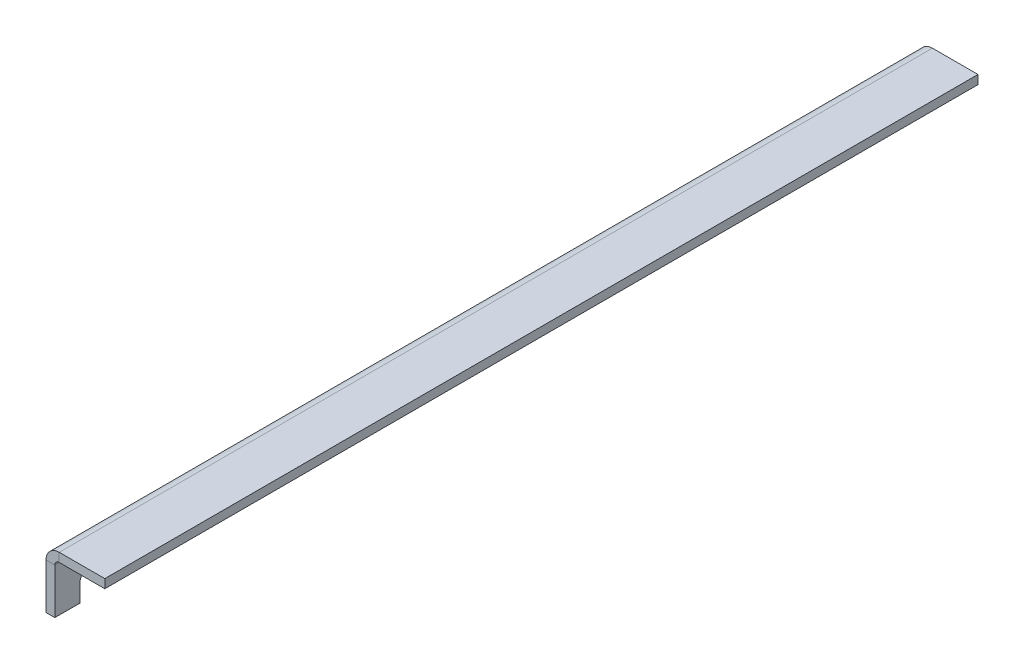
ISO-10303-21;
HEADER;
FILE_DESCRIPTION(('STEP AP214'),'2;1');
FILE_NAME('part.step','',(''),(''),'','','');
FILE_SCHEMA(('AUTOMOTIVE_DESIGN { 1 0 10303 214 1 1 1 1 }'));
ENDSEC;
DATA;
#1=APPLICATION_CONTEXT('core data for automotive mechanical design processes');
#2=APPLICATION_PROTOCOL_DEFINITION('international standard','automotive_design',2000,#1);
#3=PRODUCT_CONTEXT('',#1,'mechanical');
#4=PRODUCT('Part','Part','',(#3));
#5=PRODUCT_RELATED_PRODUCT_CATEGORY('part','',(#4));
#6=PRODUCT_DEFINITION_FORMATION('','',#4);
#7=PRODUCT_DEFINITION_CONTEXT('part definition',#1,'design');
#8=PRODUCT_DEFINITION('design','',#6,#7);
#9=PRODUCT_DEFINITION_SHAPE('','',#8);
#10=(LENGTH_UNIT() NAMED_UNIT(*) SI_UNIT(.MILLI.,.METRE.));
#11=(NAMED_UNIT(*) PLANE_ANGLE_UNIT() SI_UNIT($,.RADIAN.));
#12=(NAMED_UNIT(*) SI_UNIT($,.STERADIAN.) SOLID_ANGLE_UNIT());
#13=UNCERTAINTY_MEASURE_WITH_UNIT(LENGTH_MEASURE(1.E-05),#10,'distance_accuracy_value','');
#14=(GEOMETRIC_REPRESENTATION_CONTEXT(3) GLOBAL_UNCERTAINTY_ASSIGNED_CONTEXT((#13)) GLOBAL_UNIT_ASSIGNED_CONTEXT((#10,
#11,#12)) REPRESENTATION_CONTEXT('',''));
#15=CARTESIAN_POINT('',(0.,0.,0.));
#16=DIRECTION('',(0.,0.,1.));
#17=DIRECTION('',(1.,0.,0.));
#18=AXIS2_PLACEMENT_3D('',#15,#16,#17);
#19=CARTESIAN_POINT('',(2.99999999999994,-20.,148.5));
#20=DIRECTION('',(0.,-1.,0.));
#21=DIRECTION('',(1.,0.,0.));
#22=AXIS2_PLACEMENT_3D('',#19,#20,#21);
#23=PLANE('',#22);
#24=DIRECTION('',(-1.,0.,0.));
#25=VECTOR('',#24,1.);
#26=CARTESIAN_POINT('',(2.99999999999994,-20.,140.));
#27=LINE('',#26,#25);
#28=CARTESIAN_POINT('',(2.99999999999994,-20.,140.));
#29=VERTEX_POINT('',#28);
#30=CARTESIAN_POINT('',(-1.11022302462516E-13,-20.,140.));
#31=VERTEX_POINT('',#30);
#32=EDGE_CURVE('E245',#29,#31,#27,.T.);
#33=ORIENTED_EDGE('',*,*,#32,.F.);
#34=DIRECTION('',(0.,0.,-1.));
#35=VECTOR('',#34,1.);
#36=CARTESIAN_POINT('',(2.99999999999994,-20.,148.5));
#37=LINE('',#36,#35);
#38=CARTESIAN_POINT('',(2.99999999999994,-20.,148.5));
#39=VERTEX_POINT('',#38);
#40=EDGE_CURVE('E274',#39,#29,#37,.T.);
#41=ORIENTED_EDGE('',*,*,#40,.F.);
#42=DIRECTION('',(-1.,0.,0.));
#43=VECTOR('',#42,1.);
#44=CARTESIAN_POINT('',(2.99999999999994,-20.,148.5));
#45=LINE('',#44,#43);
#46=CARTESIAN_POINT('',(0.,-20.,148.5));
#47=VERTEX_POINT('',#46);
#48=EDGE_CURVE('E261',#39,#47,#45,.T.);
#49=ORIENTED_EDGE('',*,*,#48,.T.);
#50=DIRECTION('',(0.,0.,-1.));
#51=VECTOR('',#50,1.);
#52=CARTESIAN_POINT('',(0.,-20.,148.5));
#53=LINE('',#52,#51);
#54=EDGE_CURVE('E278',#47,#31,#53,.T.);
#55=ORIENTED_EDGE('',*,*,#54,.T.);
#56=EDGE_LOOP('',(#33,#41,#49,#55));
#57=FACE_BOUND('',#56,.T.);
#58=ADVANCED_FACE('F41',(#57),#23,.T.);
#59=CARTESIAN_POINT('',(4.49999999999999,0.,148.5));
#60=DIRECTION('',(0.,0.,1.));
#61=DIRECTION('',(1.,0.,0.));
#62=AXIS2_PLACEMENT_3D('',#59,#60,#61);
#63=PLANE('',#62);
#64=DIRECTION('',(0.,-1.,0.));
#65=VECTOR('',#64,1.);
#66=CARTESIAN_POINT('',(4.49999999999999,0.,148.5));
#67=LINE('',#66,#65);
#68=CARTESIAN_POINT('',(4.49999999999999,0.,148.5));
#69=VERTEX_POINT('',#68);
#70=CARTESIAN_POINT('',(4.49999999999999,-3.,148.5));
#71=VERTEX_POINT('',#70);
#72=EDGE_CURVE('E49',#69,#71,#67,.T.);
#73=ORIENTED_EDGE('',*,*,#72,.F.);
#74=CARTESIAN_POINT('',(4.49999999999999,-4.5,148.5));
#75=DIRECTION('',(0.,0.,1.));
#76=DIRECTION('',(1.,0.,0.));
#77=AXIS2_PLACEMENT_3D('',#74,#75,#76);
#78=CIRCLE('',#77,4.5);
#79=CARTESIAN_POINT('',(0.,-4.49999999999999,148.5));
#80=VERTEX_POINT('',#79);
#81=EDGE_CURVE('E255',#80,#69,#78,.F.);
#82=ORIENTED_EDGE('',*,*,#81,.F.);
#83=DIRECTION('',(-1.,0.,0.));
#84=VECTOR('',#83,1.);
#85=CARTESIAN_POINT('',(2.99999999999999,-4.5,148.5));
#86=LINE('',#85,#84);
#87=CARTESIAN_POINT('',(2.99999999999999,-4.5,148.5));
#88=VERTEX_POINT('',#87);
#89=EDGE_CURVE('E289',#88,#80,#86,.T.);
#90=ORIENTED_EDGE('',*,*,#89,.F.);
#91=CARTESIAN_POINT('',(4.49999999999999,-4.5,148.5));
#92=DIRECTION('',(0.,0.,1.));
#93=DIRECTION('',(1.,0.,0.));
#94=AXIS2_PLACEMENT_3D('',#91,#92,#93);
#95=CIRCLE('',#94,1.5);
#96=EDGE_CURVE('E267',#88,#71,#95,.F.);
#97=ORIENTED_EDGE('',*,*,#96,.T.);
#98=EDGE_LOOP('',(#73,#82,#90,#97));
#99=FACE_BOUND('',#98,.T.);
#100=ADVANCED_FACE('F43',(#99),#63,.T.);
#101=CARTESIAN_POINT('',(2.99999999999999,-4.5,148.5));
#102=DIRECTION('',(0.,0.,1.));
#103=DIRECTION('',(1.,0.,0.));
#104=AXIS2_PLACEMENT_3D('',#101,#102,#103);
#105=PLANE('',#104);
#106=DIRECTION('',(1.,0.,0.));
#107=VECTOR('',#106,1.);
#108=CARTESIAN_POINT('',(0.,0.,148.5));
#109=LINE('',#108,#107);
#110=CARTESIAN_POINT('',(20.,0.,148.5));
#111=VERTEX_POINT('',#110);
#112=EDGE_CURVE('E252',#69,#111,#109,.T.);
#113=ORIENTED_EDGE('',*,*,#112,.F.);
#114=ORIENTED_EDGE('',*,*,#72,.T.);
#115=DIRECTION('',(1.,0.,0.));
#116=VECTOR('',#115,1.);
#117=CARTESIAN_POINT('',(0.,-3.,148.5));
#118=LINE('',#117,#116);
#119=CARTESIAN_POINT('',(20.,-3.,148.5));
#120=VERTEX_POINT('',#119);
#121=EDGE_CURVE('E247',#71,#120,#118,.T.);
#122=ORIENTED_EDGE('',*,*,#121,.T.);
#123=DIRECTION('',(0.,-1.,0.));
#124=VECTOR('',#123,1.);
#125=CARTESIAN_POINT('',(20.,0.,148.5));
#126=LINE('',#125,#124);
#127=EDGE_CURVE('E249',#111,#120,#126,.T.);
#128=ORIENTED_EDGE('',*,*,#127,.F.);
#129=EDGE_LOOP('',(#113,#114,#122,#128));
#130=FACE_BOUND('',#129,.T.);
#131=ADVANCED_FACE('F322',(#130),#105,.T.);
#132=CARTESIAN_POINT('',(0.,-3.,148.5));
#133=DIRECTION('',(0.,1.,0.));
#134=DIRECTION('',(-1.,0.,0.));
#135=AXIS2_PLACEMENT_3D('',#132,#133,#134);
#136=PLANE('',#135);
#137=DIRECTION('',(0.,0.,-1.));
#138=VECTOR('',#137,1.);
#139=CARTESIAN_POINT('',(4.49999999999999,-3.,148.5));
#140=LINE('',#139,#138);
#141=CARTESIAN_POINT('',(4.49999999999999,-3.,-148.5));
#142=VERTEX_POINT('',#141);
#143=EDGE_CURVE('E269',#71,#142,#140,.T.);
#144=ORIENTED_EDGE('',*,*,#143,.T.);
#145=DIRECTION('',(1.,0.,0.));
#146=VECTOR('',#145,1.);
#147=CARTESIAN_POINT('',(0.,-3.,-148.5));
#148=LINE('',#147,#146);
#149=CARTESIAN_POINT('',(20.,-3.,-148.5));
#150=VERTEX_POINT('',#149);
#151=EDGE_CURVE('E189',#142,#150,#148,.T.);
#152=ORIENTED_EDGE('',*,*,#151,.T.);
#153=DIRECTION('',(0.,0.,-1.));
#154=VECTOR('',#153,1.);
#155=CARTESIAN_POINT('',(20.,-3.,148.5));
#156=LINE('',#155,#154);
#157=EDGE_CURVE('E287',#120,#150,#156,.T.);
#158=ORIENTED_EDGE('',*,*,#157,.F.);
#159=ORIENTED_EDGE('',*,*,#121,.F.);
#160=EDGE_LOOP('',(#144,#152,#158,#159));
#161=FACE_BOUND('',#160,.T.);
#162=ADVANCED_FACE('F320',(#161),#136,.F.);
#163=CARTESIAN_POINT('',(20.,0.,148.5));
#164=DIRECTION('',(1.,0.,0.));
#165=DIRECTION('',(0.,0.,-1.));
#166=AXIS2_PLACEMENT_3D('',#163,#164,#165);
#167=PLANE('',#166);
#168=ORIENTED_EDGE('',*,*,#157,.T.);
#169=DIRECTION('',(0.,-1.,0.));
#170=VECTOR('',#169,1.);
#171=CARTESIAN_POINT('',(20.,0.,-148.5));
#172=LINE('',#171,#170);
#173=CARTESIAN_POINT('',(20.,0.,-148.5));
#174=VERTEX_POINT('',#173);
#175=EDGE_CURVE('E192',#174,#150,#172,.T.);
#176=ORIENTED_EDGE('',*,*,#175,.F.);
#177=DIRECTION('',(0.,0.,-1.));
#178=VECTOR('',#177,1.);
#179=CARTESIAN_POINT('',(20.,0.,148.5));
#180=LINE('',#179,#178);
#181=EDGE_CURVE('E285',#111,#174,#180,.T.);
#182=ORIENTED_EDGE('',*,*,#181,.F.);
#183=ORIENTED_EDGE('',*,*,#127,.T.);
#184=EDGE_LOOP('',(#168,#176,#182,#183));
#185=FACE_BOUND('',#184,.T.);
#186=ADVANCED_FACE('F333',(#185),#167,.T.);
#187=CARTESIAN_POINT('',(0.,0.,148.5));
#188=DIRECTION('',(0.,1.,0.));
#189=DIRECTION('',(-1.,0.,0.));
#190=AXIS2_PLACEMENT_3D('',#187,#188,#189);
#191=PLANE('',#190);
#192=ORIENTED_EDGE('',*,*,#181,.T.);
#193=DIRECTION('',(1.,0.,0.));
#194=VECTOR('',#193,1.);
#195=CARTESIAN_POINT('',(0.,0.,-148.5));
#196=LINE('',#195,#194);
#197=CARTESIAN_POINT('',(4.49999999999999,0.,-148.5));
#198=VERTEX_POINT('',#197);
#199=EDGE_CURVE('E195',#198,#174,#196,.T.);
#200=ORIENTED_EDGE('',*,*,#199,.F.);
#201=DIRECTION('',(0.,0.,-1.));
#202=VECTOR('',#201,1.);
#203=CARTESIAN_POINT('',(4.49999999999999,0.,148.5));
#204=LINE('',#203,#202);
#205=EDGE_CURVE('E283',#69,#198,#204,.T.);
#206=ORIENTED_EDGE('',*,*,#205,.F.);
#207=ORIENTED_EDGE('',*,*,#112,.T.);
#208=EDGE_LOOP('',(#192,#200,#206,#207));
#209=FACE_BOUND('',#208,.T.);
#210=ADVANCED_FACE('F325',(#209),#191,.T.);
#211=CARTESIAN_POINT('',(4.49999999999999,-4.5,148.5));
#212=DIRECTION('',(0.,0.,-1.));
#213=DIRECTION('',(-1.,0.,0.));
#214=AXIS2_PLACEMENT_3D('',#211,#212,#213);
#215=CYLINDRICAL_SURFACE('',#214,4.5);
#216=ORIENTED_EDGE('',*,*,#205,.T.);
#217=CARTESIAN_POINT('',(4.49999999999999,-4.5,-148.5));
#218=DIRECTION('',(0.,0.,1.));
#219=DIRECTION('',(1.,0.,0.));
#220=AXIS2_PLACEMENT_3D('',#217,#218,#219);
#221=CIRCLE('',#220,4.5);
#222=CARTESIAN_POINT('',(0.,-4.49999999999999,-148.5));
#223=VERTEX_POINT('',#222);
#224=EDGE_CURVE('E198',#223,#198,#221,.F.);
#225=ORIENTED_EDGE('',*,*,#224,.F.);
#226=DIRECTION('',(0.,0.,-1.));
#227=VECTOR('',#226,1.);
#228=CARTESIAN_POINT('',(0.,-4.49999999999999,148.5));
#229=LINE('',#228,#227);
#230=EDGE_CURVE('E281',#80,#223,#229,.T.);
#231=ORIENTED_EDGE('',*,*,#230,.F.);
#232=ORIENTED_EDGE('',*,*,#81,.T.);
#233=EDGE_LOOP('',(#216,#225,#231,#232));
#234=FACE_BOUND('',#233,.T.);
#235=ADVANCED_FACE('F301',(#234),#215,.T.);
#236=CARTESIAN_POINT('',(0.,-20.,148.5));
#237=DIRECTION('',(-1.,0.,0.));
#238=DIRECTION('',(0.,-1.,0.));
#239=AXIS2_PLACEMENT_3D('',#236,#237,#238);
#240=PLANE('',#239);
#241=DIRECTION('',(0.,-1.,0.));
#242=VECTOR('',#241,1.);
#243=CARTESIAN_POINT('',(-1.26201132877313E-13,-25.5000000000001,140.));
#244=LINE('',#243,#242);
#245=CARTESIAN_POINT('',(0.,-14.5,140.));
#246=VERTEX_POINT('',#245);
#247=EDGE_CURVE('E234',#246,#31,#244,.T.);
#248=ORIENTED_EDGE('',*,*,#247,.T.);
#249=ORIENTED_EDGE('',*,*,#54,.F.);
#250=DIRECTION('',(0.,1.,0.));
#251=VECTOR('',#250,1.);
#252=CARTESIAN_POINT('',(0.,-20.,148.5));
#253=LINE('',#252,#251);
#254=EDGE_CURVE('E258',#47,#80,#253,.T.);
#255=ORIENTED_EDGE('',*,*,#254,.T.);
#256=ORIENTED_EDGE('',*,*,#230,.T.);
#257=DIRECTION('',(0.,1.,0.));
#258=VECTOR('',#257,1.);
#259=CARTESIAN_POINT('',(0.,-20.,-148.5));
#260=LINE('',#259,#258);
#261=CARTESIAN_POINT('',(0.,-20.,-148.5));
#262=VERTEX_POINT('',#261);
#263=EDGE_CURVE('E201',#262,#223,#260,.T.);
#264=ORIENTED_EDGE('',*,*,#263,.F.);
#265=DIRECTION('',(0.,0.,1.));
#266=VECTOR('',#265,1.);
#267=CARTESIAN_POINT('',(0.,-20.,-148.5));
#268=LINE('',#267,#266);
#269=CARTESIAN_POINT('',(-1.11022302462516E-13,-20.,-140.));
#270=VERTEX_POINT('',#269);
#271=EDGE_CURVE('E216',#262,#270,#268,.T.);
#272=ORIENTED_EDGE('',*,*,#271,.T.);
#273=DIRECTION('',(0.,-1.,0.));
#274=VECTOR('',#273,1.);
#275=CARTESIAN_POINT('',(-1.26201132877313E-13,-25.5000000000001,-140.));
#276=LINE('',#275,#274);
#277=CARTESIAN_POINT('',(0.,-14.5,-140.));
#278=VERTEX_POINT('',#277);
#279=EDGE_CURVE('E164',#278,#270,#276,.T.);
#280=ORIENTED_EDGE('',*,*,#279,.F.);
#281=CARTESIAN_POINT('',(0.,-14.5,-135.));
#282=DIRECTION('',(-1.,0.,0.));
#283=DIRECTION('',(0.,1.,0.));
#284=AXIS2_PLACEMENT_3D('',#281,#282,#283);
#285=CIRCLE('',#284,5.);
#286=CARTESIAN_POINT('',(0.,-14.5,-130.));
#287=VERTEX_POINT('',#286);
#288=EDGE_CURVE('E156',#287,#278,#285,.T.);
#289=ORIENTED_EDGE('',*,*,#288,.F.);
#290=DIRECTION('',(0.,1.,0.));
#291=VECTOR('',#290,1.);
#292=CARTESIAN_POINT('',(-1.26201132877313E-13,-25.5000000000001,-130.));
#293=LINE('',#292,#291);
#294=CARTESIAN_POINT('',(-1.11022302462516E-13,-20.,-130.));
#295=VERTEX_POINT('',#294);
#296=EDGE_CURVE('E168',#295,#287,#293,.T.);
#297=ORIENTED_EDGE('',*,*,#296,.F.);
#298=CARTESIAN_POINT('',(-1.11022302462516E-13,-20.,130.));
#299=VERTEX_POINT('',#298);
#300=EDGE_CURVE('E277',#299,#295,#53,.T.);
#301=ORIENTED_EDGE('',*,*,#300,.F.);
#302=DIRECTION('',(0.,1.,0.));
#303=VECTOR('',#302,1.);
#304=CARTESIAN_POINT('',(-1.26201132877313E-13,-25.5000000000001,130.));
#305=LINE('',#304,#303);
#306=CARTESIAN_POINT('',(0.,-14.5,130.));
#307=VERTEX_POINT('',#306);
#308=EDGE_CURVE('E227',#299,#307,#305,.T.);
#309=ORIENTED_EDGE('',*,*,#308,.T.);
#310=CARTESIAN_POINT('',(0.,-14.5,135.));
#311=DIRECTION('',(1.,0.,0.));
#312=DIRECTION('',(0.,1.,0.));
#313=AXIS2_PLACEMENT_3D('',#310,#311,#312);
#314=CIRCLE('',#313,5.);
#315=EDGE_CURVE('E230',#307,#246,#314,.T.);
#316=ORIENTED_EDGE('',*,*,#315,.T.);
#317=EDGE_LOOP('',(#248,#249,#255,#256,#264,#272,#280,#289,#297,#301,#309,#316));
#318=FACE_BOUND('',#317,.T.);
#319=ADVANCED_FACE('F177',(#318),#240,.T.);
#320=DIRECTION('',(1.,0.,0.));
#321=VECTOR('',#320,1.);
#322=CARTESIAN_POINT('',(2.99999999999994,-20.,130.));
#323=LINE('',#322,#321);
#324=CARTESIAN_POINT('',(2.99999999999994,-20.,130.));
#325=VERTEX_POINT('',#324);
#326=EDGE_CURVE('E56',#299,#325,#323,.T.);
#327=ORIENTED_EDGE('',*,*,#326,.F.);
#328=ORIENTED_EDGE('',*,*,#300,.T.);
#329=DIRECTION('',(1.,0.,0.));
#330=VECTOR('',#329,1.);
#331=CARTESIAN_POINT('',(2.99999999999994,-20.,-130.));
#332=LINE('',#331,#330);
#333=CARTESIAN_POINT('',(2.99999999999994,-20.,-130.));
#334=VERTEX_POINT('',#333);
#335=EDGE_CURVE('E171',#295,#334,#332,.T.);
#336=ORIENTED_EDGE('',*,*,#335,.T.);
#337=EDGE_CURVE('E273',#325,#334,#37,.T.);
#338=ORIENTED_EDGE('',*,*,#337,.F.);
#339=EDGE_LOOP('',(#327,#328,#336,#338));
#340=FACE_BOUND('',#339,.T.);
#341=ADVANCED_FACE('F344',(#340),#23,.T.);
#342=CARTESIAN_POINT('',(2.99999999999994,-20.,148.5));
#343=DIRECTION('',(-1.,0.,0.));
#344=DIRECTION('',(0.,-1.,0.));
#345=AXIS2_PLACEMENT_3D('',#342,#343,#344);
#346=PLANE('',#345);
#347=ORIENTED_EDGE('',*,*,#40,.T.);
#348=DIRECTION('',(0.,-1.,0.));
#349=VECTOR('',#348,1.);
#350=CARTESIAN_POINT('',(2.99999999999993,-25.5000000000001,140.));
#351=LINE('',#350,#349);
#352=CARTESIAN_POINT('',(2.99999999999996,-14.5,140.));
#353=VERTEX_POINT('',#352);
#354=EDGE_CURVE('E231',#353,#29,#351,.T.);
#355=ORIENTED_EDGE('',*,*,#354,.F.);
#356=CARTESIAN_POINT('',(2.99999999999996,-14.5,135.));
#357=DIRECTION('',(1.,0.,0.));
#358=DIRECTION('',(0.,1.,0.));
#359=AXIS2_PLACEMENT_3D('',#356,#357,#358);
#360=CIRCLE('',#359,5.);
#361=CARTESIAN_POINT('',(2.99999999999996,-14.5,130.));
#362=VERTEX_POINT('',#361);
#363=EDGE_CURVE('E226',#362,#353,#360,.T.);
#364=ORIENTED_EDGE('',*,*,#363,.F.);
#365=DIRECTION('',(0.,-1.,0.));
#366=VECTOR('',#365,1.);
#367=CARTESIAN_POINT('',(2.99999999999994,-20.,130.));
#368=LINE('',#367,#366);
#369=EDGE_CURVE('E11',#362,#325,#368,.T.);
#370=ORIENTED_EDGE('',*,*,#369,.T.);
#371=ORIENTED_EDGE('',*,*,#337,.T.);
#372=DIRECTION('',(0.,-1.,0.));
#373=VECTOR('',#372,1.);
#374=CARTESIAN_POINT('',(2.99999999999994,-20.,-130.));
#375=LINE('',#374,#373);
#376=CARTESIAN_POINT('',(2.99999999999996,-14.5,-130.));
#377=VERTEX_POINT('',#376);
#378=EDGE_CURVE('E224',#377,#334,#375,.T.);
#379=ORIENTED_EDGE('',*,*,#378,.F.);
#380=CARTESIAN_POINT('',(2.99999999999996,-14.5,-135.));
#381=DIRECTION('',(-1.,0.,0.));
#382=DIRECTION('',(0.,1.,0.));
#383=AXIS2_PLACEMENT_3D('',#380,#381,#382);
#384=CIRCLE('',#383,5.);
#385=CARTESIAN_POINT('',(2.99999999999996,-14.5,-140.));
#386=VERTEX_POINT('',#385);
#387=EDGE_CURVE('E159',#377,#386,#384,.T.);
#388=ORIENTED_EDGE('',*,*,#387,.T.);
#389=DIRECTION('',(0.,-1.,0.));
#390=VECTOR('',#389,1.);
#391=CARTESIAN_POINT('',(2.99999999999993,-25.5000000000001,-140.));
#392=LINE('',#391,#390);
#393=CARTESIAN_POINT('',(2.99999999999994,-20.,-140.));
#394=VERTEX_POINT('',#393);
#395=EDGE_CURVE('E174',#386,#394,#392,.T.);
#396=ORIENTED_EDGE('',*,*,#395,.T.);
#397=DIRECTION('',(0.,0.,1.));
#398=VECTOR('',#397,1.);
#399=CARTESIAN_POINT('',(2.99999999999994,-20.,-148.5));
#400=LINE('',#399,#398);
#401=CARTESIAN_POINT('',(2.99999999999994,-20.,-148.5));
#402=VERTEX_POINT('',#401);
#403=EDGE_CURVE('E213',#402,#394,#400,.T.);
#404=ORIENTED_EDGE('',*,*,#403,.F.);
#405=DIRECTION('',(0.,1.,0.));
#406=VECTOR('',#405,1.);
#407=CARTESIAN_POINT('',(2.99999999999994,-20.,-148.5));
#408=LINE('',#407,#406);
#409=CARTESIAN_POINT('',(2.99999999999999,-4.5,-148.5));
#410=VERTEX_POINT('',#409);
#411=EDGE_CURVE('E207',#402,#410,#408,.T.);
#412=ORIENTED_EDGE('',*,*,#411,.T.);
#413=DIRECTION('',(0.,0.,-1.));
#414=VECTOR('',#413,1.);
#415=CARTESIAN_POINT('',(2.99999999999999,-4.5,148.5));
#416=LINE('',#415,#414);
#417=EDGE_CURVE('E271',#88,#410,#416,.T.);
#418=ORIENTED_EDGE('',*,*,#417,.F.);
#419=DIRECTION('',(0.,1.,0.));
#420=VECTOR('',#419,1.);
#421=CARTESIAN_POINT('',(2.99999999999994,-20.,148.5));
#422=LINE('',#421,#420);
#423=EDGE_CURVE('E264',#39,#88,#422,.T.);
#424=ORIENTED_EDGE('',*,*,#423,.F.);
#425=EDGE_LOOP('',(#347,#355,#364,#370,#371,#379,#388,#396,#404,#412,#418,#424));
#426=FACE_BOUND('',#425,.T.);
#427=ADVANCED_FACE('F308',(#426),#346,.F.);
#428=CARTESIAN_POINT('',(4.49999999999999,-4.5,148.5));
#429=DIRECTION('',(0.,0.,-1.));
#430=DIRECTION('',(-1.,0.,0.));
#431=AXIS2_PLACEMENT_3D('',#428,#429,#430);
#432=CYLINDRICAL_SURFACE('',#431,1.5);
#433=ORIENTED_EDGE('',*,*,#417,.T.);
#434=CARTESIAN_POINT('',(4.49999999999999,-4.5,-148.5));
#435=DIRECTION('',(0.,0.,1.));
#436=DIRECTION('',(1.,0.,0.));
#437=AXIS2_PLACEMENT_3D('',#434,#435,#436);
#438=CIRCLE('',#437,1.5);
#439=EDGE_CURVE('E210',#410,#142,#438,.F.);
#440=ORIENTED_EDGE('',*,*,#439,.T.);
#441=ORIENTED_EDGE('',*,*,#143,.F.);
#442=ORIENTED_EDGE('',*,*,#96,.F.);
#443=EDGE_LOOP('',(#433,#440,#441,#442));
#444=FACE_BOUND('',#443,.T.);
#445=ADVANCED_FACE('F314',(#444),#432,.F.);
#446=CARTESIAN_POINT('',(4.49999999999999,-4.5,148.5));
#447=DIRECTION('',(0.,0.,1.));
#448=DIRECTION('',(1.,0.,0.));
#449=AXIS2_PLACEMENT_3D('',#446,#447,#448);
#450=PLANE('',#449);
#451=ORIENTED_EDGE('',*,*,#423,.T.);
#452=ORIENTED_EDGE('',*,*,#89,.T.);
#453=ORIENTED_EDGE('',*,*,#254,.F.);
#454=ORIENTED_EDGE('',*,*,#48,.F.);
#455=EDGE_LOOP('',(#451,#452,#453,#454));
#456=FACE_BOUND('',#455,.T.);
#457=ADVANCED_FACE('F293',(#456),#450,.T.);
#458=CARTESIAN_POINT('',(-1.26201132877313E-13,-25.5000000000001,140.));
#459=DIRECTION('',(0.,0.,1.));
#460=DIRECTION('',(1.,0.,0.));
#461=AXIS2_PLACEMENT_3D('',#458,#459,#460);
#462=PLANE('',#461);
#463=ORIENTED_EDGE('',*,*,#32,.T.);
#464=ORIENTED_EDGE('',*,*,#247,.F.);
#465=DIRECTION('',(1.,0.,0.));
#466=VECTOR('',#465,1.);
#467=CARTESIAN_POINT('',(0.,-14.5,140.));
#468=LINE('',#467,#466);
#469=EDGE_CURVE('E240',#246,#353,#468,.T.);
#470=ORIENTED_EDGE('',*,*,#469,.T.);
#471=ORIENTED_EDGE('',*,*,#354,.T.);
#472=EDGE_LOOP('',(#463,#464,#470,#471));
#473=FACE_BOUND('',#472,.T.);
#474=ADVANCED_FACE('F363',(#473),#462,.F.);
#475=CARTESIAN_POINT('',(0.,-14.5,135.));
#476=DIRECTION('',(1.,0.,0.));
#477=DIRECTION('',(0.,1.,0.));
#478=AXIS2_PLACEMENT_3D('',#475,#476,#477);
#479=CYLINDRICAL_SURFACE('',#478,5.);
#480=ORIENTED_EDGE('',*,*,#363,.T.);
#481=ORIENTED_EDGE('',*,*,#469,.F.);
#482=ORIENTED_EDGE('',*,*,#315,.F.);
#483=DIRECTION('',(1.,0.,0.));
#484=VECTOR('',#483,1.);
#485=CARTESIAN_POINT('',(0.,-14.5,130.));
#486=LINE('',#485,#484);
#487=EDGE_CURVE('E236',#307,#362,#486,.T.);
#488=ORIENTED_EDGE('',*,*,#487,.T.);
#489=EDGE_LOOP('',(#480,#481,#482,#488));
#490=FACE_BOUND('',#489,.T.);
#491=ADVANCED_FACE('F361',(#490),#479,.F.);
#492=CARTESIAN_POINT('',(-1.26201132877313E-13,-25.5000000000001,130.));
#493=DIRECTION('',(0.,0.,-1.));
#494=DIRECTION('',(-1.,0.,0.));
#495=AXIS2_PLACEMENT_3D('',#492,#493,#494);
#496=PLANE('',#495);
#497=ORIENTED_EDGE('',*,*,#326,.T.);
#498=ORIENTED_EDGE('',*,*,#369,.F.);
#499=ORIENTED_EDGE('',*,*,#487,.F.);
#500=ORIENTED_EDGE('',*,*,#308,.F.);
#501=EDGE_LOOP('',(#497,#498,#499,#500));
#502=FACE_BOUND('',#501,.T.);
#503=ADVANCED_FACE('F358',(#502),#496,.F.);
#504=CARTESIAN_POINT('',(2.99999999999994,-20.,-148.5));
#505=DIRECTION('',(0.,-1.,0.));
#506=DIRECTION('',(1.,0.,0.));
#507=AXIS2_PLACEMENT_3D('',#504,#505,#506);
#508=PLANE('',#507);
#509=DIRECTION('',(-1.,0.,0.));
#510=VECTOR('',#509,1.);
#511=CARTESIAN_POINT('',(2.99999999999994,-20.,-140.));
#512=LINE('',#511,#510);
#513=EDGE_CURVE('E186',#394,#270,#512,.T.);
#514=ORIENTED_EDGE('',*,*,#513,.T.);
#515=ORIENTED_EDGE('',*,*,#271,.F.);
#516=DIRECTION('',(-1.,0.,0.));
#517=VECTOR('',#516,1.);
#518=CARTESIAN_POINT('',(2.99999999999994,-20.,-148.5));
#519=LINE('',#518,#517);
#520=EDGE_CURVE('E204',#402,#262,#519,.T.);
#521=ORIENTED_EDGE('',*,*,#520,.F.);
#522=ORIENTED_EDGE('',*,*,#403,.T.);
#523=EDGE_LOOP('',(#514,#515,#521,#522));
#524=FACE_BOUND('',#523,.T.);
#525=ADVANCED_FACE('F369',(#524),#508,.T.);
#526=CARTESIAN_POINT('',(4.49999999999999,0.,-148.5));
#527=DIRECTION('',(0.,0.,-1.));
#528=DIRECTION('',(1.,0.,0.));
#529=AXIS2_PLACEMENT_3D('',#526,#527,#528);
#530=PLANE('',#529);
#531=DIRECTION('',(0.,-1.,0.));
#532=VECTOR('',#531,1.);
#533=CARTESIAN_POINT('',(4.49999999999999,0.,-148.5));
#534=LINE('',#533,#532);
#535=EDGE_CURVE('E221',#198,#142,#534,.T.);
#536=ORIENTED_EDGE('',*,*,#535,.T.);
#537=ORIENTED_EDGE('',*,*,#439,.F.);
#538=DIRECTION('',(-1.,0.,0.));
#539=VECTOR('',#538,1.);
#540=CARTESIAN_POINT('',(2.99999999999999,-4.5,-148.5));
#541=LINE('',#540,#539);
#542=EDGE_CURVE('E218',#410,#223,#541,.T.);
#543=ORIENTED_EDGE('',*,*,#542,.T.);
#544=ORIENTED_EDGE('',*,*,#224,.T.);
#545=EDGE_LOOP('',(#536,#537,#543,#544));
#546=FACE_BOUND('',#545,.T.);
#547=ADVANCED_FACE('F331',(#546),#530,.T.);
#548=CARTESIAN_POINT('',(2.99999999999999,-4.5,-148.5));
#549=DIRECTION('',(0.,0.,-1.));
#550=DIRECTION('',(1.,0.,0.));
#551=AXIS2_PLACEMENT_3D('',#548,#549,#550);
#552=PLANE('',#551);
#553=ORIENTED_EDGE('',*,*,#199,.T.);
#554=ORIENTED_EDGE('',*,*,#175,.T.);
#555=ORIENTED_EDGE('',*,*,#151,.F.);
#556=ORIENTED_EDGE('',*,*,#535,.F.);
#557=EDGE_LOOP('',(#553,#554,#555,#556));
#558=FACE_BOUND('',#557,.T.);
#559=ADVANCED_FACE('F332',(#558),#552,.T.);
#560=CARTESIAN_POINT('',(4.49999999999999,-4.5,-148.5));
#561=DIRECTION('',(0.,0.,-1.));
#562=DIRECTION('',(1.,0.,0.));
#563=AXIS2_PLACEMENT_3D('',#560,#561,#562);
#564=PLANE('',#563);
#565=ORIENTED_EDGE('',*,*,#411,.F.);
#566=ORIENTED_EDGE('',*,*,#520,.T.);
#567=ORIENTED_EDGE('',*,*,#263,.T.);
#568=ORIENTED_EDGE('',*,*,#542,.F.);
#569=EDGE_LOOP('',(#565,#566,#567,#568));
#570=FACE_BOUND('',#569,.T.);
#571=ADVANCED_FACE('F373',(#570),#564,.T.);
#572=CARTESIAN_POINT('',(-1.26201132877313E-13,-25.5000000000001,-140.));
#573=DIRECTION('',(0.,0.,-1.));
#574=DIRECTION('',(1.,0.,0.));
#575=AXIS2_PLACEMENT_3D('',#572,#573,#574);
#576=PLANE('',#575);
#577=ORIENTED_EDGE('',*,*,#513,.F.);
#578=ORIENTED_EDGE('',*,*,#395,.F.);
#579=DIRECTION('',(1.,0.,0.));
#580=VECTOR('',#579,1.);
#581=CARTESIAN_POINT('',(0.,-14.5,-140.));
#582=LINE('',#581,#580);
#583=EDGE_CURVE('E163',#278,#386,#582,.T.);
#584=ORIENTED_EDGE('',*,*,#583,.F.);
#585=ORIENTED_EDGE('',*,*,#279,.T.);
#586=EDGE_LOOP('',(#577,#578,#584,#585));
#587=FACE_BOUND('',#586,.T.);
#588=ADVANCED_FACE('F371',(#587),#576,.F.);
#589=CARTESIAN_POINT('',(0.,-14.5,-135.));
#590=DIRECTION('',(1.,0.,0.));
#591=DIRECTION('',(0.,1.,0.));
#592=AXIS2_PLACEMENT_3D('',#589,#590,#591);
#593=CYLINDRICAL_SURFACE('',#592,5.);
#594=ORIENTED_EDGE('',*,*,#387,.F.);
#595=DIRECTION('',(1.,0.,0.));
#596=VECTOR('',#595,1.);
#597=CARTESIAN_POINT('',(0.,-14.5,-130.));
#598=LINE('',#597,#596);
#599=EDGE_CURVE('E152',#287,#377,#598,.T.);
#600=ORIENTED_EDGE('',*,*,#599,.F.);
#601=ORIENTED_EDGE('',*,*,#288,.T.);
#602=ORIENTED_EDGE('',*,*,#583,.T.);
#603=EDGE_LOOP('',(#594,#600,#601,#602));
#604=FACE_BOUND('',#603,.T.);
#605=ADVANCED_FACE('F154',(#604),#593,.F.);
#606=CARTESIAN_POINT('',(-1.26201132877313E-13,-25.5000000000001,-130.));
#607=DIRECTION('',(0.,0.,1.));
#608=DIRECTION('',(-1.,0.,0.));
#609=AXIS2_PLACEMENT_3D('',#606,#607,#608);
#610=PLANE('',#609);
#611=ORIENTED_EDGE('',*,*,#335,.F.);
#612=ORIENTED_EDGE('',*,*,#296,.T.);
#613=ORIENTED_EDGE('',*,*,#599,.T.);
#614=ORIENTED_EDGE('',*,*,#378,.T.);
#615=EDGE_LOOP('',(#611,#612,#613,#614));
#616=FACE_BOUND('',#615,.T.);
#617=ADVANCED_FACE('F169',(#616),#610,.F.);
#618=CLOSED_SHELL('',(#58,#100,#131,#162,#186,#210,#235,#319,#341,#427,#445,#457,#474,#491,#503,
#525,#547,#559,#571,#588,#605,#617));
#619=MANIFOLD_SOLID_BREP('B2',#618);
#620=ADVANCED_BREP_SHAPE_REPRESENTATION('',(#18,#619),#14);
#621=SHAPE_DEFINITION_REPRESENTATION(#9,#620);
ENDSEC;
END-ISO-10303-21;
